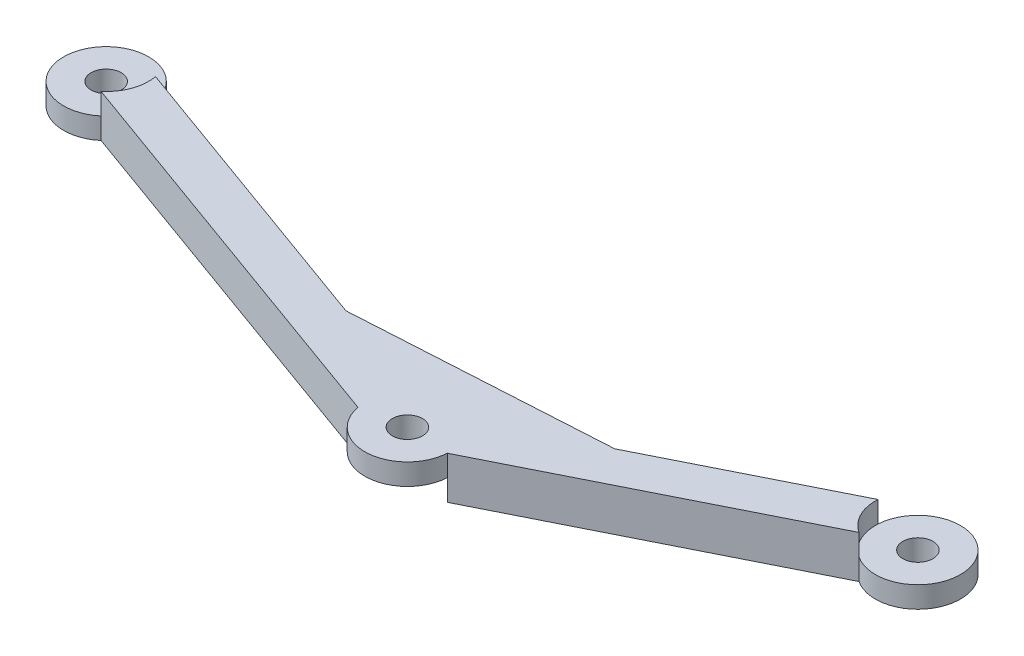
ISO-10303-21;
HEADER;
FILE_DESCRIPTION(('STEP AP214'),'2;1');
FILE_NAME('part.step','',(''),(''),'','','');
FILE_SCHEMA(('AUTOMOTIVE_DESIGN { 1 0 10303 214 1 1 1 1 }'));
ENDSEC;
DATA;
#1=APPLICATION_CONTEXT('core data for automotive mechanical design processes');
#2=APPLICATION_PROTOCOL_DEFINITION('international standard','automotive_design',2000,#1);
#3=PRODUCT_CONTEXT('',#1,'mechanical');
#4=PRODUCT('Part','Part','',(#3));
#5=PRODUCT_RELATED_PRODUCT_CATEGORY('part','',(#4));
#6=PRODUCT_DEFINITION_FORMATION('','',#4);
#7=PRODUCT_DEFINITION_CONTEXT('part definition',#1,'design');
#8=PRODUCT_DEFINITION('design','',#6,#7);
#9=PRODUCT_DEFINITION_SHAPE('','',#8);
#10=(LENGTH_UNIT() NAMED_UNIT(*) SI_UNIT(.MILLI.,.METRE.));
#11=(NAMED_UNIT(*) PLANE_ANGLE_UNIT() SI_UNIT($,.RADIAN.));
#12=(NAMED_UNIT(*) SI_UNIT($,.STERADIAN.) SOLID_ANGLE_UNIT());
#13=UNCERTAINTY_MEASURE_WITH_UNIT(LENGTH_MEASURE(1.E-05),#10,'distance_accuracy_value','');
#14=(GEOMETRIC_REPRESENTATION_CONTEXT(3) GLOBAL_UNCERTAINTY_ASSIGNED_CONTEXT((#13)) GLOBAL_UNIT_ASSIGNED_CONTEXT((#10,
#11,#12)) REPRESENTATION_CONTEXT('',''));
#15=CARTESIAN_POINT('',(0.,0.,0.));
#16=DIRECTION('',(0.,0.,1.));
#17=DIRECTION('',(1.,0.,0.));
#18=AXIS2_PLACEMENT_3D('',#15,#16,#17);
#19=CARTESIAN_POINT('',(70.358,6.35,25.4));
#20=DIRECTION('',(0.,-1.,0.));
#21=DIRECTION('',(0.,0.,-1.));
#22=AXIS2_PLACEMENT_3D('',#19,#20,#21);
#23=CYLINDRICAL_SURFACE('',#22,6.35);
#24=CARTESIAN_POINT('',(70.358,3.175,25.4));
#25=DIRECTION('',(0.,-1.,0.));
#26=DIRECTION('',(0.,0.,-1.));
#27=AXIS2_PLACEMENT_3D('',#24,#25,#26);
#28=CIRCLE('',#27,6.35000000000001);
#29=CARTESIAN_POINT('',(76.6965920153958,3.175,25.780461906583));
#30=VERTEX_POINT('',#29);
#31=CARTESIAN_POINT('',(64.1073764028365,3.175,26.5190195023246));
#32=VERTEX_POINT('',#31);
#33=EDGE_CURVE('E231',#30,#32,#28,.T.);
#34=ORIENTED_EDGE('',*,*,#33,.F.);
#35=DIRECTION('',(0.,-1.,0.));
#36=VECTOR('',#35,1.);
#37=CARTESIAN_POINT('',(76.6965920153958,6.35,25.780461906583));
#38=LINE('',#37,#36);
#39=CARTESIAN_POINT('',(76.6965920153958,6.35,25.780461906583));
#40=VERTEX_POINT('',#39);
#41=EDGE_CURVE('E173',#40,#30,#38,.T.);
#42=ORIENTED_EDGE('',*,*,#41,.F.);
#43=CARTESIAN_POINT('',(70.358,6.35,25.4));
#44=DIRECTION('',(0.,1.,0.));
#45=DIRECTION('',(0.,0.,1.));
#46=AXIS2_PLACEMENT_3D('',#43,#44,#45);
#47=CIRCLE('',#46,6.35);
#48=CARTESIAN_POINT('',(64.1073764028365,6.35,26.5190195023246));
#49=VERTEX_POINT('',#48);
#50=EDGE_CURVE('E50',#49,#40,#47,.T.);
#51=ORIENTED_EDGE('',*,*,#50,.F.);
#52=DIRECTION('',(0.,-1.,0.));
#53=VECTOR('',#52,1.);
#54=CARTESIAN_POINT('',(64.1073764028365,6.35,26.5190195023246));
#55=LINE('',#54,#53);
#56=EDGE_CURVE('E176',#49,#32,#55,.T.);
#57=ORIENTED_EDGE('',*,*,#56,.T.);
#58=EDGE_LOOP('',(#34,#42,#51,#57));
#59=FACE_BOUND('',#58,.T.);
#60=ADVANCED_FACE('F33',(#59),#23,.T.);
#61=CARTESIAN_POINT('',(70.358,6.35,25.4));
#62=DIRECTION('',(0.,-1.,0.));
#63=DIRECTION('',(0.,0.,-1.));
#64=AXIS2_PLACEMENT_3D('',#61,#62,#63);
#65=CYLINDRICAL_SURFACE('',#64,2.24789999999999);
#66=CARTESIAN_POINT('',(70.358,6.35,25.4));
#67=DIRECTION('',(0.,1.,0.));
#68=DIRECTION('',(0.,0.,1.));
#69=AXIS2_PLACEMENT_3D('',#66,#67,#68);
#70=CIRCLE('',#69,2.24789999999999);
#71=CARTESIAN_POINT('',(70.358,6.35,27.6479));
#72=VERTEX_POINT('',#71);
#73=EDGE_CURVE('E198',#72,#72,#70,.T.);
#74=ORIENTED_EDGE('',*,*,#73,.T.);
#75=EDGE_LOOP('',(#74));
#76=FACE_BOUND('',#75,.T.);
#77=CARTESIAN_POINT('',(70.358,3.175,25.4));
#78=DIRECTION('',(0.,-1.,0.));
#79=DIRECTION('',(0.,0.,-1.));
#80=AXIS2_PLACEMENT_3D('',#77,#78,#79);
#81=CIRCLE('',#80,2.24789999999999);
#82=CARTESIAN_POINT('',(70.358,3.175,23.1521));
#83=VERTEX_POINT('',#82);
#84=EDGE_CURVE('E214',#83,#83,#81,.T.);
#85=ORIENTED_EDGE('',*,*,#84,.T.);
#86=EDGE_LOOP('',(#85));
#87=FACE_BOUND('',#86,.T.);
#88=ADVANCED_FACE('F281',(#76,#87),#65,.F.);
#89=CARTESIAN_POINT('',(121.158,6.35,0.));
#90=DIRECTION('',(0.,-1.,0.));
#91=DIRECTION('',(0.,0.,-1.));
#92=AXIS2_PLACEMENT_3D('',#89,#90,#91);
#93=CYLINDRICAL_SURFACE('',#92,6.35000000000008);
#94=CARTESIAN_POINT('',(121.158,3.175,0.));
#95=DIRECTION('',(0.,1.,0.));
#96=DIRECTION('',(0.,0.,1.));
#97=AXIS2_PLACEMENT_3D('',#94,#95,#96);
#98=CIRCLE('',#97,6.35000000000008);
#99=CARTESIAN_POINT('',(117.659214316029,3.175,5.29915075626648));
#100=VERTEX_POINT('',#99);
#101=CARTESIAN_POINT('',(114.819407984604,3.175,-0.380461906582968));
#102=VERTEX_POINT('',#101);
#103=EDGE_CURVE('E213',#100,#102,#98,.T.);
#104=ORIENTED_EDGE('',*,*,#103,.F.);
#105=DIRECTION('',(0.,-1.,0.));
#106=VECTOR('',#105,1.);
#107=CARTESIAN_POINT('',(117.659214316029,6.35,5.29915075626648));
#108=LINE('',#107,#106);
#109=CARTESIAN_POINT('',(117.659214316029,0.,5.29915075626648));
#110=VERTEX_POINT('',#109);
#111=EDGE_CURVE('E79',#100,#110,#108,.T.);
#112=ORIENTED_EDGE('',*,*,#111,.T.);
#113=CARTESIAN_POINT('',(121.158,0.,0.));
#114=DIRECTION('',(0.,1.,0.));
#115=DIRECTION('',(0.,0.,1.));
#116=AXIS2_PLACEMENT_3D('',#113,#114,#115);
#117=CIRCLE('',#116,6.35000000000008);
#118=CARTESIAN_POINT('',(114.819407984604,0.,-0.380461906582968));
#119=VERTEX_POINT('',#118);
#120=EDGE_CURVE('E151',#110,#119,#117,.T.);
#121=ORIENTED_EDGE('',*,*,#120,.T.);
#122=DIRECTION('',(0.,-1.,0.));
#123=VECTOR('',#122,1.);
#124=CARTESIAN_POINT('',(114.819407984604,6.35,-0.380461906582968));
#125=LINE('',#124,#123);
#126=EDGE_CURVE('E150',#102,#119,#125,.T.);
#127=ORIENTED_EDGE('',*,*,#126,.F.);
#128=EDGE_LOOP('',(#104,#112,#121,#127));
#129=FACE_BOUND('',#128,.T.);
#130=ADVANCED_FACE('F266',(#129),#93,.T.);
#131=CARTESIAN_POINT('',(0.,6.35,0.));
#132=DIRECTION('',(0.,-1.,0.));
#133=DIRECTION('',(0.,0.,-1.));
#134=AXIS2_PLACEMENT_3D('',#131,#132,#133);
#135=CYLINDRICAL_SURFACE('',#134,6.35);
#136=CARTESIAN_POINT('',(0.,3.175,0.));
#137=DIRECTION('',(0.,1.,0.));
#138=DIRECTION('',(0.,0.,1.));
#139=AXIS2_PLACEMENT_3D('',#136,#137,#138);
#140=CIRCLE('',#139,6.35);
#141=CARTESIAN_POINT('',(6.2506235971635,3.175,-1.11901950232461));
#142=VERTEX_POINT('',#141);
#143=CARTESIAN_POINT('',(4.09441111492511,3.175,4.85368907347573));
#144=VERTEX_POINT('',#143);
#145=EDGE_CURVE('E221',#142,#144,#140,.T.);
#146=ORIENTED_EDGE('',*,*,#145,.F.);
#147=DIRECTION('',(0.,-1.,0.));
#148=VECTOR('',#147,1.);
#149=CARTESIAN_POINT('',(6.2506235971635,6.35,-1.11901950232461));
#150=LINE('',#149,#148);
#151=CARTESIAN_POINT('',(6.2506235971635,0.,-1.11901950232461));
#152=VERTEX_POINT('',#151);
#153=EDGE_CURVE('E183',#142,#152,#150,.T.);
#154=ORIENTED_EDGE('',*,*,#153,.T.);
#155=CARTESIAN_POINT('',(0.,0.,0.));
#156=DIRECTION('',(0.,1.,0.));
#157=DIRECTION('',(0.,0.,1.));
#158=AXIS2_PLACEMENT_3D('',#155,#156,#157);
#159=CIRCLE('',#158,6.35);
#160=CARTESIAN_POINT('',(4.09441111492511,0.,4.85368907347573));
#161=VERTEX_POINT('',#160);
#162=EDGE_CURVE('E153',#152,#161,#159,.T.);
#163=ORIENTED_EDGE('',*,*,#162,.T.);
#164=DIRECTION('',(0.,-1.,0.));
#165=VECTOR('',#164,1.);
#166=CARTESIAN_POINT('',(4.09441111492511,6.35,4.85368907347573));
#167=LINE('',#166,#165);
#168=EDGE_CURVE('E179',#144,#161,#167,.T.);
#169=ORIENTED_EDGE('',*,*,#168,.F.);
#170=EDGE_LOOP('',(#146,#154,#163,#169));
#171=FACE_BOUND('',#170,.T.);
#172=ADVANCED_FACE('F251',(#171),#135,.T.);
#173=CARTESIAN_POINT('',(121.158,6.35,0.));
#174=DIRECTION('',(0.,-1.,0.));
#175=DIRECTION('',(0.,0.,-1.));
#176=AXIS2_PLACEMENT_3D('',#173,#174,#175);
#177=CYLINDRICAL_SURFACE('',#176,2.2479);
#178=CARTESIAN_POINT('',(121.158,0.,0.));
#179=DIRECTION('',(0.,1.,0.));
#180=DIRECTION('',(0.,0.,1.));
#181=AXIS2_PLACEMENT_3D('',#178,#179,#180);
#182=CIRCLE('',#181,2.2479);
#183=CARTESIAN_POINT('',(121.158,0.,2.2479));
#184=VERTEX_POINT('',#183);
#185=EDGE_CURVE('E155',#184,#184,#182,.T.);
#186=ORIENTED_EDGE('',*,*,#185,.F.);
#187=EDGE_LOOP('',(#186));
#188=FACE_BOUND('',#187,.T.);
#189=CARTESIAN_POINT('',(121.158,3.175,0.));
#190=DIRECTION('',(0.,1.,0.));
#191=DIRECTION('',(0.,0.,1.));
#192=AXIS2_PLACEMENT_3D('',#189,#190,#191);
#193=CIRCLE('',#192,2.2479);
#194=CARTESIAN_POINT('',(121.158,3.175,2.2479));
#195=VERTEX_POINT('',#194);
#196=EDGE_CURVE('E189',#195,#195,#193,.T.);
#197=ORIENTED_EDGE('',*,*,#196,.T.);
#198=EDGE_LOOP('',(#197));
#199=FACE_BOUND('',#198,.T.);
#200=ADVANCED_FACE('F35',(#188,#199),#177,.F.);
#201=CARTESIAN_POINT('',(0.,6.35,0.));
#202=DIRECTION('',(0.,-1.,0.));
#203=DIRECTION('',(0.,0.,-1.));
#204=AXIS2_PLACEMENT_3D('',#201,#202,#203);
#205=CYLINDRICAL_SURFACE('',#204,2.2479);
#206=CARTESIAN_POINT('',(0.,0.,0.));
#207=DIRECTION('',(0.,1.,0.));
#208=DIRECTION('',(0.,0.,1.));
#209=AXIS2_PLACEMENT_3D('',#206,#207,#208);
#210=CIRCLE('',#209,2.2479);
#211=CARTESIAN_POINT('',(0.,0.,2.2479));
#212=VERTEX_POINT('',#211);
#213=EDGE_CURVE('E167',#212,#212,#210,.T.);
#214=ORIENTED_EDGE('',*,*,#213,.F.);
#215=EDGE_LOOP('',(#214));
#216=FACE_BOUND('',#215,.T.);
#217=CARTESIAN_POINT('',(0.,3.175,0.));
#218=DIRECTION('',(0.,1.,0.));
#219=DIRECTION('',(0.,0.,1.));
#220=AXIS2_PLACEMENT_3D('',#217,#218,#219);
#221=CIRCLE('',#220,2.2479);
#222=CARTESIAN_POINT('',(0.,3.175,2.2479));
#223=VERTEX_POINT('',#222);
#224=EDGE_CURVE('E187',#223,#223,#221,.T.);
#225=ORIENTED_EDGE('',*,*,#224,.T.);
#226=EDGE_LOOP('',(#225));
#227=FACE_BOUND('',#226,.T.);
#228=ADVANCED_FACE('F298',(#216,#227),#205,.F.);
#229=CARTESIAN_POINT('',(22.8116968342877,6.35,45.6233936685753));
#230=DIRECTION('',(0.447213595499958,0.,0.894427190999916));
#231=DIRECTION('',(0.894427190999916,0.,-0.447213595499958));
#232=AXIS2_PLACEMENT_3D('',#229,#230,#231);
#233=PLANE('',#232);
#234=DIRECTION('',(-0.894427190999916,0.,0.447213595499958));
#235=VECTOR('',#234,1.);
#236=CARTESIAN_POINT('',(22.8116968342877,0.,45.6233936685753));
#237=LINE('',#236,#235);
#238=CARTESIAN_POINT('',(88.6237786073797,0.,12.7173527820293));
#239=VERTEX_POINT('',#238);
#240=EDGE_CURVE('E144',#119,#239,#237,.T.);
#241=ORIENTED_EDGE('',*,*,#240,.T.);
#242=DIRECTION('',(0.,1.,0.));
#243=VECTOR('',#242,1.);
#244=CARTESIAN_POINT('',(88.6237786073797,0.,12.7173527820293));
#245=LINE('',#244,#243);
#246=CARTESIAN_POINT('',(88.6237786073797,6.35,12.7173527820293));
#247=VERTEX_POINT('',#246);
#248=EDGE_CURVE('E126',#239,#247,#245,.T.);
#249=ORIENTED_EDGE('',*,*,#248,.T.);
#250=DIRECTION('',(-0.894427190999916,0.,0.447213595499958));
#251=VECTOR('',#250,1.);
#252=CARTESIAN_POINT('',(22.8116968342877,6.35,45.6233936685753));
#253=LINE('',#252,#251);
#254=CARTESIAN_POINT('',(114.819407984604,6.35,-0.380461906582968));
#255=VERTEX_POINT('',#254);
#256=EDGE_CURVE('E170',#255,#247,#253,.T.);
#257=ORIENTED_EDGE('',*,*,#256,.F.);
#258=EDGE_CURVE('E42',#255,#102,#125,.T.);
#259=ORIENTED_EDGE('',*,*,#258,.T.);
#260=ORIENTED_EDGE('',*,*,#126,.T.);
#261=EDGE_LOOP('',(#241,#249,#257,#259,#260));
#262=FACE_BOUND('',#261,.T.);
#263=ADVANCED_FACE('F148',(#262),#233,.F.);
#264=CARTESIAN_POINT('',(1.07810624111919,6.35,-2.98635428790017));
#265=DIRECTION('',(-0.339561020824945,0.,0.940584027685098));
#266=DIRECTION('',(0.940584027685098,0.,0.339561020824945));
#267=AXIS2_PLACEMENT_3D('',#264,#265,#266);
#268=PLANE('',#267);
#269=DIRECTION('',(-0.940584027685098,0.,-0.339561020824945));
#270=VECTOR('',#269,1.);
#271=CARTESIAN_POINT('',(1.07810624111919,6.35,-2.98635428790017));
#272=LINE('',#271,#270);
#273=CARTESIAN_POINT('',(50.7345465879939,6.35,14.9401584727044));
#274=VERTEX_POINT('',#273);
#275=CARTESIAN_POINT('',(6.2506235971635,6.35,-1.11901950232461));
#276=VERTEX_POINT('',#275);
#277=EDGE_CURVE('E208',#274,#276,#272,.T.);
#278=ORIENTED_EDGE('',*,*,#277,.F.);
#279=DIRECTION('',(0.,1.,0.));
#280=VECTOR('',#279,1.);
#281=CARTESIAN_POINT('',(50.7345465879939,0.,14.9401584727044));
#282=LINE('',#281,#280);
#283=CARTESIAN_POINT('',(50.7345465879939,0.,14.9401584727044));
#284=VERTEX_POINT('',#283);
#285=EDGE_CURVE('E137',#284,#274,#282,.T.);
#286=ORIENTED_EDGE('',*,*,#285,.F.);
#287=DIRECTION('',(-0.940584027685098,0.,-0.339561020824945));
#288=VECTOR('',#287,1.);
#289=CARTESIAN_POINT('',(1.07810624111919,0.,-2.98635428790017));
#290=LINE('',#289,#288);
#291=EDGE_CURVE('E146',#284,#152,#290,.T.);
#292=ORIENTED_EDGE('',*,*,#291,.T.);
#293=ORIENTED_EDGE('',*,*,#153,.F.);
#294=EDGE_CURVE('E184',#276,#142,#150,.T.);
#295=ORIENTED_EDGE('',*,*,#294,.F.);
#296=EDGE_LOOP('',(#278,#286,#292,#293,#295));
#297=FACE_BOUND('',#296,.T.);
#298=ADVANCED_FACE('F240',(#297),#268,.F.);
#299=CARTESIAN_POINT('',(-1.0781062411192,6.35,2.98635428790017));
#300=DIRECTION('',(-0.339561020824945,0.,0.940584027685098));
#301=DIRECTION('',(0.940584027685098,0.,0.339561020824945));
#302=AXIS2_PLACEMENT_3D('',#299,#300,#301);
#303=PLANE('',#302);
#304=DIRECTION('',(-0.940584027685098,0.,-0.339561020824945));
#305=VECTOR('',#304,1.);
#306=CARTESIAN_POINT('',(-1.0781062411192,0.,2.98635428790017));
#307=LINE('',#306,#305);
#308=CARTESIAN_POINT('',(64.1073764028365,0.,26.5190195023246));
#309=VERTEX_POINT('',#308);
#310=EDGE_CURVE('E161',#309,#161,#307,.T.);
#311=ORIENTED_EDGE('',*,*,#310,.F.);
#312=DIRECTION('',(0.,-1.,0.));
#313=VECTOR('',#312,1.);
#314=CARTESIAN_POINT('',(64.1073764028365,3.175,26.5190195023246));
#315=LINE('',#314,#313);
#316=EDGE_CURVE('E72',#32,#309,#315,.T.);
#317=ORIENTED_EDGE('',*,*,#316,.F.);
#318=ORIENTED_EDGE('',*,*,#56,.F.);
#319=DIRECTION('',(-0.940584027685098,0.,-0.339561020824945));
#320=VECTOR('',#319,1.);
#321=CARTESIAN_POINT('',(-1.0781062411192,6.35,2.98635428790017));
#322=LINE('',#321,#320);
#323=CARTESIAN_POINT('',(4.09441111492511,6.35,4.85368907347573));
#324=VERTEX_POINT('',#323);
#325=EDGE_CURVE('E205',#49,#324,#322,.T.);
#326=ORIENTED_EDGE('',*,*,#325,.T.);
#327=EDGE_CURVE('E180',#324,#144,#167,.T.);
#328=ORIENTED_EDGE('',*,*,#327,.T.);
#329=ORIENTED_EDGE('',*,*,#168,.T.);
#330=EDGE_LOOP('',(#311,#317,#318,#326,#328,#329));
#331=FACE_BOUND('',#330,.T.);
#332=ADVANCED_FACE('F254',(#331),#303,.T.);
#333=CARTESIAN_POINT('',(25.6515031657123,6.35,51.3030063314247));
#334=DIRECTION('',(0.447213595499958,0.,0.894427190999916));
#335=DIRECTION('',(0.894427190999916,0.,-0.447213595499958));
#336=AXIS2_PLACEMENT_3D('',#333,#334,#335);
#337=PLANE('',#336);
#338=DIRECTION('',(-0.894427190999916,0.,0.447213595499958));
#339=VECTOR('',#338,1.);
#340=CARTESIAN_POINT('',(25.6515031657123,0.,51.3030063314247));
#341=LINE('',#340,#339);
#342=CARTESIAN_POINT('',(76.6965920153958,0.,25.780461906583));
#343=VERTEX_POINT('',#342);
#344=EDGE_CURVE('E164',#110,#343,#341,.T.);
#345=ORIENTED_EDGE('',*,*,#344,.F.);
#346=ORIENTED_EDGE('',*,*,#111,.F.);
#347=CARTESIAN_POINT('',(117.659214316029,6.35,5.29915075626648));
#348=VERTEX_POINT('',#347);
#349=EDGE_CURVE('E171',#348,#100,#108,.T.);
#350=ORIENTED_EDGE('',*,*,#349,.F.);
#351=DIRECTION('',(-0.894427190999916,0.,0.447213595499958));
#352=VECTOR('',#351,1.);
#353=CARTESIAN_POINT('',(25.6515031657123,6.35,51.3030063314247));
#354=LINE('',#353,#352);
#355=EDGE_CURVE('E201',#348,#40,#354,.T.);
#356=ORIENTED_EDGE('',*,*,#355,.T.);
#357=ORIENTED_EDGE('',*,*,#41,.T.);
#358=DIRECTION('',(0.,-1.,0.));
#359=VECTOR('',#358,1.);
#360=CARTESIAN_POINT('',(76.6965920153958,3.175,25.780461906583));
#361=LINE('',#360,#359);
#362=EDGE_CURVE('E227',#343,#30,#361,.F.);
#363=ORIENTED_EDGE('',*,*,#362,.F.);
#364=EDGE_LOOP('',(#345,#346,#350,#356,#357,#363));
#365=FACE_BOUND('',#364,.T.);
#366=ADVANCED_FACE('F262',(#365),#337,.T.);
#367=CARTESIAN_POINT('',(0.,6.35,0.));
#368=DIRECTION('',(0.,1.,0.));
#369=DIRECTION('',(0.,0.,1.));
#370=AXIS2_PLACEMENT_3D('',#367,#368,#369);
#371=PLANE('',#370);
#372=DIRECTION('',(-0.998283585660039,0.,0.0585651995790627));
#373=VECTOR('',#372,1.);
#374=CARTESIAN_POINT('',(50.7345465879939,6.35,14.9401584727044));
#375=LINE('',#374,#373);
#376=EDGE_CURVE('E132',#247,#274,#375,.T.);
#377=ORIENTED_EDGE('',*,*,#376,.T.);
#378=ORIENTED_EDGE('',*,*,#277,.T.);
#379=CARTESIAN_POINT('',(0.,6.35,0.));
#380=DIRECTION('',(0.,1.,0.));
#381=DIRECTION('',(0.,0.,1.));
#382=AXIS2_PLACEMENT_3D('',#379,#380,#381);
#383=CIRCLE('',#382,6.35);
#384=EDGE_CURVE('E218',#324,#276,#383,.T.);
#385=ORIENTED_EDGE('',*,*,#384,.F.);
#386=ORIENTED_EDGE('',*,*,#325,.F.);
#387=ORIENTED_EDGE('',*,*,#50,.T.);
#388=ORIENTED_EDGE('',*,*,#355,.F.);
#389=CARTESIAN_POINT('',(121.158,6.35,0.));
#390=DIRECTION('',(0.,1.,0.));
#391=DIRECTION('',(0.,0.,1.));
#392=AXIS2_PLACEMENT_3D('',#389,#390,#391);
#393=CIRCLE('',#392,6.35000000000008);
#394=EDGE_CURVE('E211',#255,#348,#393,.T.);
#395=ORIENTED_EDGE('',*,*,#394,.F.);
#396=ORIENTED_EDGE('',*,*,#256,.T.);
#397=EDGE_LOOP('',(#377,#378,#385,#386,#387,#388,#395,#396));
#398=FACE_BOUND('',#397,.T.);
#399=ORIENTED_EDGE('',*,*,#73,.F.);
#400=EDGE_LOOP('',(#399));
#401=FACE_BOUND('',#400,.T.);
#402=ADVANCED_FACE('F235',(#398,#401),#371,.T.);
#403=CARTESIAN_POINT('',(0.,0.,0.));
#404=DIRECTION('',(0.,1.,0.));
#405=DIRECTION('',(0.,0.,1.));
#406=AXIS2_PLACEMENT_3D('',#403,#404,#405);
#407=PLANE('',#406);
#408=ORIENTED_EDGE('',*,*,#291,.F.);
#409=DIRECTION('',(-0.998283585660039,0.,0.0585651995790627));
#410=VECTOR('',#409,1.);
#411=CARTESIAN_POINT('',(50.7345465879939,0.,14.9401584727044));
#412=LINE('',#411,#410);
#413=EDGE_CURVE('E129',#239,#284,#412,.T.);
#414=ORIENTED_EDGE('',*,*,#413,.F.);
#415=ORIENTED_EDGE('',*,*,#240,.F.);
#416=ORIENTED_EDGE('',*,*,#120,.F.);
#417=ORIENTED_EDGE('',*,*,#344,.T.);
#418=CARTESIAN_POINT('',(70.358,0.,25.4));
#419=DIRECTION('',(0.,1.,0.));
#420=DIRECTION('',(0.,0.,1.));
#421=AXIS2_PLACEMENT_3D('',#418,#419,#420);
#422=CIRCLE('',#421,6.35000000000001);
#423=EDGE_CURVE('E11',#343,#309,#422,.T.);
#424=ORIENTED_EDGE('',*,*,#423,.T.);
#425=ORIENTED_EDGE('',*,*,#310,.T.);
#426=ORIENTED_EDGE('',*,*,#162,.F.);
#427=EDGE_LOOP('',(#408,#414,#415,#416,#417,#424,#425,#426));
#428=FACE_BOUND('',#427,.T.);
#429=ORIENTED_EDGE('',*,*,#213,.T.);
#430=EDGE_LOOP('',(#429));
#431=FACE_BOUND('',#430,.T.);
#432=ORIENTED_EDGE('',*,*,#185,.T.);
#433=EDGE_LOOP('',(#432));
#434=FACE_BOUND('',#433,.T.);
#435=ADVANCED_FACE('F142',(#428,#431,#434),#407,.F.);
#436=CARTESIAN_POINT('',(121.158,3.175,0.));
#437=DIRECTION('',(0.,1.,0.));
#438=DIRECTION('',(0.,0.,1.));
#439=AXIS2_PLACEMENT_3D('',#436,#437,#438);
#440=CYLINDRICAL_SURFACE('',#439,6.35000000000008);
#441=ORIENTED_EDGE('',*,*,#394,.T.);
#442=ORIENTED_EDGE('',*,*,#349,.T.);
#443=EDGE_CURVE('E215',#102,#100,#98,.T.);
#444=ORIENTED_EDGE('',*,*,#443,.F.);
#445=ORIENTED_EDGE('',*,*,#258,.F.);
#446=EDGE_LOOP('',(#441,#442,#444,#445));
#447=FACE_BOUND('',#446,.T.);
#448=ADVANCED_FACE('F263',(#447),#440,.F.);
#449=CARTESIAN_POINT('',(121.158,3.175,0.));
#450=DIRECTION('',(0.,1.,0.));
#451=DIRECTION('',(0.,0.,1.));
#452=AXIS2_PLACEMENT_3D('',#449,#450,#451);
#453=PLANE('',#452);
#454=ORIENTED_EDGE('',*,*,#196,.F.);
#455=EDGE_LOOP('',(#454));
#456=FACE_BOUND('',#455,.T.);
#457=ORIENTED_EDGE('',*,*,#443,.T.);
#458=ORIENTED_EDGE('',*,*,#103,.T.);
#459=EDGE_LOOP('',(#457,#458));
#460=FACE_BOUND('',#459,.T.);
#461=ADVANCED_FACE('F265',(#456,#460),#453,.T.);
#462=CARTESIAN_POINT('',(0.,3.175,0.));
#463=DIRECTION('',(0.,1.,0.));
#464=DIRECTION('',(0.,0.,1.));
#465=AXIS2_PLACEMENT_3D('',#462,#463,#464);
#466=CYLINDRICAL_SURFACE('',#465,6.35);
#467=EDGE_CURVE('E190',#144,#142,#140,.T.);
#468=ORIENTED_EDGE('',*,*,#467,.F.);
#469=ORIENTED_EDGE('',*,*,#327,.F.);
#470=ORIENTED_EDGE('',*,*,#384,.T.);
#471=ORIENTED_EDGE('',*,*,#294,.T.);
#472=EDGE_LOOP('',(#468,#469,#470,#471));
#473=FACE_BOUND('',#472,.T.);
#474=ADVANCED_FACE('F245',(#473),#466,.F.);
#475=CARTESIAN_POINT('',(0.,3.175,0.));
#476=DIRECTION('',(0.,1.,0.));
#477=DIRECTION('',(0.,0.,1.));
#478=AXIS2_PLACEMENT_3D('',#475,#476,#477);
#479=PLANE('',#478);
#480=ORIENTED_EDGE('',*,*,#224,.F.);
#481=EDGE_LOOP('',(#480));
#482=FACE_BOUND('',#481,.T.);
#483=ORIENTED_EDGE('',*,*,#467,.T.);
#484=ORIENTED_EDGE('',*,*,#145,.T.);
#485=EDGE_LOOP('',(#483,#484));
#486=FACE_BOUND('',#485,.T.);
#487=ADVANCED_FACE('F249',(#482,#486),#479,.T.);
#488=CARTESIAN_POINT('',(70.358,3.175,25.4));
#489=DIRECTION('',(0.,-1.,0.));
#490=DIRECTION('',(0.,0.,-1.));
#491=AXIS2_PLACEMENT_3D('',#488,#489,#490);
#492=CYLINDRICAL_SURFACE('',#491,6.35000000000001);
#493=ORIENTED_EDGE('',*,*,#423,.F.);
#494=ORIENTED_EDGE('',*,*,#362,.T.);
#495=EDGE_CURVE('E229',#32,#30,#28,.T.);
#496=ORIENTED_EDGE('',*,*,#495,.F.);
#497=ORIENTED_EDGE('',*,*,#316,.T.);
#498=EDGE_LOOP('',(#493,#494,#496,#497));
#499=FACE_BOUND('',#498,.T.);
#500=ADVANCED_FACE('F267',(#499),#492,.F.);
#501=CARTESIAN_POINT('',(70.358,3.175,25.4));
#502=DIRECTION('',(0.,-1.,0.));
#503=DIRECTION('',(0.,0.,-1.));
#504=AXIS2_PLACEMENT_3D('',#501,#502,#503);
#505=PLANE('',#504);
#506=ORIENTED_EDGE('',*,*,#84,.F.);
#507=EDGE_LOOP('',(#506));
#508=FACE_BOUND('',#507,.T.);
#509=ORIENTED_EDGE('',*,*,#495,.T.);
#510=ORIENTED_EDGE('',*,*,#33,.T.);
#511=EDGE_LOOP('',(#509,#510));
#512=FACE_BOUND('',#511,.T.);
#513=ADVANCED_FACE('F269',(#508,#512),#505,.T.);
#514=CARTESIAN_POINT('',(50.7345465879939,0.,14.9401584727044));
#515=DIRECTION('',(-0.0585651995790627,0.,-0.998283585660039));
#516=DIRECTION('',(-0.998283585660039,0.,0.0585651995790627));
#517=AXIS2_PLACEMENT_3D('',#514,#515,#516);
#518=PLANE('',#517);
#519=ORIENTED_EDGE('',*,*,#376,.F.);
#520=ORIENTED_EDGE('',*,*,#248,.F.);
#521=ORIENTED_EDGE('',*,*,#413,.T.);
#522=ORIENTED_EDGE('',*,*,#285,.T.);
#523=EDGE_LOOP('',(#519,#520,#521,#522));
#524=FACE_BOUND('',#523,.T.);
#525=ADVANCED_FACE('F128',(#524),#518,.T.);
#526=CLOSED_SHELL('',(#60,#88,#130,#172,#200,#228,#263,#298,#332,#366,#402,#435,#448,#461,#474,
#487,#500,#513,#525));
#527=MANIFOLD_SOLID_BREP('B2',#526);
#528=ADVANCED_BREP_SHAPE_REPRESENTATION('',(#18,#527),#14);
#529=SHAPE_DEFINITION_REPRESENTATION(#9,#528);
ENDSEC;
END-ISO-10303-21;
